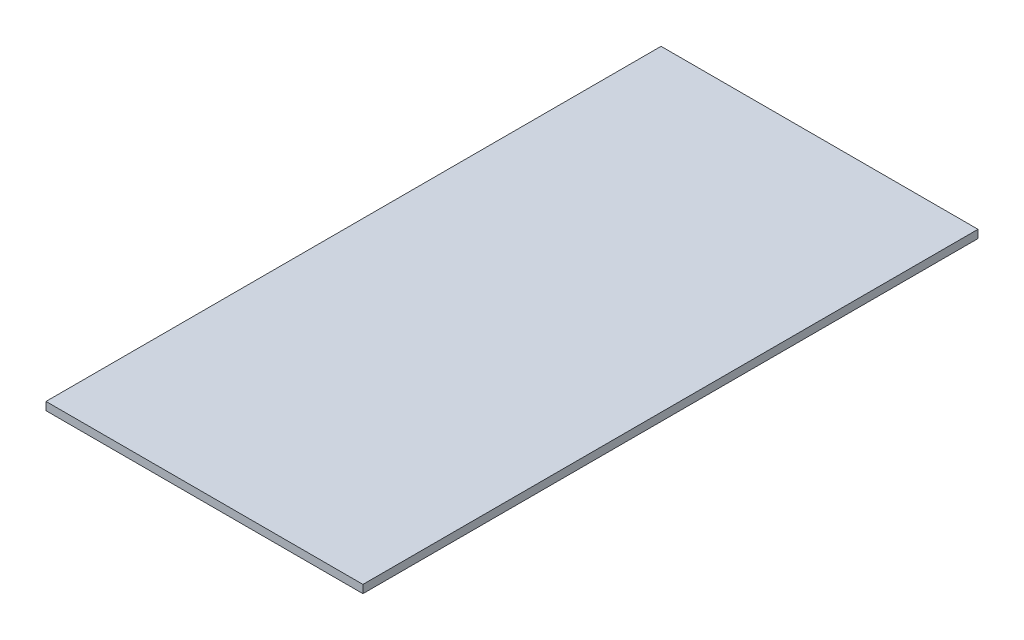
ISO-10303-21;
HEADER;
FILE_DESCRIPTION(('STEP AP214'),'2;1');
FILE_NAME('part.step','',(''),(''),'','','');
FILE_SCHEMA(('AUTOMOTIVE_DESIGN { 1 0 10303 214 1 1 1 1 }'));
ENDSEC;
DATA;
#1=APPLICATION_CONTEXT('core data for automotive mechanical design processes');
#2=APPLICATION_PROTOCOL_DEFINITION('international standard','automotive_design',2000,#1);
#3=PRODUCT_CONTEXT('',#1,'mechanical');
#4=PRODUCT('Part','Part','',(#3));
#5=PRODUCT_RELATED_PRODUCT_CATEGORY('part','',(#4));
#6=PRODUCT_DEFINITION_FORMATION('','',#4);
#7=PRODUCT_DEFINITION_CONTEXT('part definition',#1,'design');
#8=PRODUCT_DEFINITION('design','',#6,#7);
#9=PRODUCT_DEFINITION_SHAPE('','',#8);
#10=(LENGTH_UNIT() NAMED_UNIT(*) SI_UNIT(.MILLI.,.METRE.));
#11=(NAMED_UNIT(*) PLANE_ANGLE_UNIT() SI_UNIT($,.RADIAN.));
#12=(NAMED_UNIT(*) SI_UNIT($,.STERADIAN.) SOLID_ANGLE_UNIT());
#13=UNCERTAINTY_MEASURE_WITH_UNIT(LENGTH_MEASURE(1.E-05),#10,'distance_accuracy_value','');
#14=(GEOMETRIC_REPRESENTATION_CONTEXT(3) GLOBAL_UNCERTAINTY_ASSIGNED_CONTEXT((#13)) GLOBAL_UNIT_ASSIGNED_CONTEXT((#10,
#11,#12)) REPRESENTATION_CONTEXT('',''));
#15=CARTESIAN_POINT('',(0.,0.,0.));
#16=DIRECTION('',(0.,0.,1.));
#17=DIRECTION('',(1.,0.,0.));
#18=AXIS2_PLACEMENT_3D('',#15,#16,#17);
#19=CARTESIAN_POINT('',(59.,3.,114.5));
#20=DIRECTION('',(-1.,0.,0.));
#21=DIRECTION('',(0.,0.,1.));
#22=AXIS2_PLACEMENT_3D('',#19,#20,#21);
#23=PLANE('',#22);
#24=DIRECTION('',(0.,0.,-1.));
#25=VECTOR('',#24,1.);
#26=CARTESIAN_POINT('',(59.,0.,114.5));
#27=LINE('',#26,#25);
#28=CARTESIAN_POINT('',(59.,0.,114.5));
#29=VERTEX_POINT('',#28);
#30=CARTESIAN_POINT('',(59.,0.,-114.5));
#31=VERTEX_POINT('',#30);
#32=EDGE_CURVE('E113',#29,#31,#27,.T.);
#33=ORIENTED_EDGE('',*,*,#32,.T.);
#34=DIRECTION('',(0.,-1.,0.));
#35=VECTOR('',#34,1.);
#36=CARTESIAN_POINT('',(59.,3.,-114.5));
#37=LINE('',#36,#35);
#38=CARTESIAN_POINT('',(59.,3.,-114.5));
#39=VERTEX_POINT('',#38);
#40=EDGE_CURVE('E11',#39,#31,#37,.T.);
#41=ORIENTED_EDGE('',*,*,#40,.F.);
#42=DIRECTION('',(0.,0.,-1.));
#43=VECTOR('',#42,1.);
#44=CARTESIAN_POINT('',(59.,3.,114.5));
#45=LINE('',#44,#43);
#46=CARTESIAN_POINT('',(59.,3.,114.5));
#47=VERTEX_POINT('',#46);
#48=EDGE_CURVE('E97',#47,#39,#45,.T.);
#49=ORIENTED_EDGE('',*,*,#48,.F.);
#50=DIRECTION('',(0.,-1.,0.));
#51=VECTOR('',#50,1.);
#52=CARTESIAN_POINT('',(59.,3.,114.5));
#53=LINE('',#52,#51);
#54=EDGE_CURVE('E109',#47,#29,#53,.T.);
#55=ORIENTED_EDGE('',*,*,#54,.T.);
#56=EDGE_LOOP('',(#33,#41,#49,#55));
#57=FACE_BOUND('',#56,.T.);
#58=ADVANCED_FACE('F45',(#57),#23,.F.);
#59=CARTESIAN_POINT('',(-59.,3.,-114.5));
#60=DIRECTION('',(0.,0.,1.));
#61=DIRECTION('',(1.,0.,0.));
#62=AXIS2_PLACEMENT_3D('',#59,#60,#61);
#63=PLANE('',#62);
#64=DIRECTION('',(-1.,0.,0.));
#65=VECTOR('',#64,1.);
#66=CARTESIAN_POINT('',(-59.,0.,-114.5));
#67=LINE('',#66,#65);
#68=CARTESIAN_POINT('',(-59.,0.,-114.5));
#69=VERTEX_POINT('',#68);
#70=EDGE_CURVE('E102',#31,#69,#67,.T.);
#71=ORIENTED_EDGE('',*,*,#70,.T.);
#72=DIRECTION('',(0.,-1.,0.));
#73=VECTOR('',#72,1.);
#74=CARTESIAN_POINT('',(-59.,3.,-114.5));
#75=LINE('',#74,#73);
#76=CARTESIAN_POINT('',(-59.,3.,-114.5));
#77=VERTEX_POINT('',#76);
#78=EDGE_CURVE('E54',#77,#69,#75,.T.);
#79=ORIENTED_EDGE('',*,*,#78,.F.);
#80=DIRECTION('',(-1.,0.,0.));
#81=VECTOR('',#80,1.);
#82=CARTESIAN_POINT('',(-59.,3.,-114.5));
#83=LINE('',#82,#81);
#84=EDGE_CURVE('E92',#39,#77,#83,.T.);
#85=ORIENTED_EDGE('',*,*,#84,.F.);
#86=ORIENTED_EDGE('',*,*,#40,.T.);
#87=EDGE_LOOP('',(#71,#79,#85,#86));
#88=FACE_BOUND('',#87,.T.);
#89=ADVANCED_FACE('F101',(#88),#63,.F.);
#90=CARTESIAN_POINT('',(-59.,3.,114.5));
#91=DIRECTION('',(1.,0.,0.));
#92=DIRECTION('',(0.,0.,-1.));
#93=AXIS2_PLACEMENT_3D('',#90,#91,#92);
#94=PLANE('',#93);
#95=DIRECTION('',(0.,0.,1.));
#96=VECTOR('',#95,1.);
#97=CARTESIAN_POINT('',(-59.,0.,114.5));
#98=LINE('',#97,#96);
#99=CARTESIAN_POINT('',(-59.,0.,114.5));
#100=VERTEX_POINT('',#99);
#101=EDGE_CURVE('E79',#69,#100,#98,.T.);
#102=ORIENTED_EDGE('',*,*,#101,.T.);
#103=DIRECTION('',(0.,-1.,0.));
#104=VECTOR('',#103,1.);
#105=CARTESIAN_POINT('',(-59.,3.,114.5));
#106=LINE('',#105,#104);
#107=CARTESIAN_POINT('',(-59.,3.,114.5));
#108=VERTEX_POINT('',#107);
#109=EDGE_CURVE('E104',#108,#100,#106,.T.);
#110=ORIENTED_EDGE('',*,*,#109,.F.);
#111=DIRECTION('',(0.,0.,1.));
#112=VECTOR('',#111,1.);
#113=CARTESIAN_POINT('',(-59.,3.,114.5));
#114=LINE('',#113,#112);
#115=EDGE_CURVE('E95',#77,#108,#114,.T.);
#116=ORIENTED_EDGE('',*,*,#115,.F.);
#117=ORIENTED_EDGE('',*,*,#78,.T.);
#118=EDGE_LOOP('',(#102,#110,#116,#117));
#119=FACE_BOUND('',#118,.T.);
#120=ADVANCED_FACE('F105',(#119),#94,.F.);
#121=CARTESIAN_POINT('',(-59.,3.,114.5));
#122=DIRECTION('',(0.,0.,-1.));
#123=DIRECTION('',(-1.,0.,0.));
#124=AXIS2_PLACEMENT_3D('',#121,#122,#123);
#125=PLANE('',#124);
#126=DIRECTION('',(1.,0.,0.));
#127=VECTOR('',#126,1.);
#128=CARTESIAN_POINT('',(-59.,0.,114.5));
#129=LINE('',#128,#127);
#130=EDGE_CURVE('E85',#100,#29,#129,.T.);
#131=ORIENTED_EDGE('',*,*,#130,.T.);
#132=ORIENTED_EDGE('',*,*,#54,.F.);
#133=DIRECTION('',(1.,0.,0.));
#134=VECTOR('',#133,1.);
#135=CARTESIAN_POINT('',(-59.,3.,114.5));
#136=LINE('',#135,#134);
#137=EDGE_CURVE('E62',#108,#47,#136,.T.);
#138=ORIENTED_EDGE('',*,*,#137,.F.);
#139=ORIENTED_EDGE('',*,*,#109,.T.);
#140=EDGE_LOOP('',(#131,#132,#138,#139));
#141=FACE_BOUND('',#140,.T.);
#142=ADVANCED_FACE('F126',(#141),#125,.F.);
#143=CARTESIAN_POINT('',(0.,3.,0.));
#144=DIRECTION('',(0.,-1.,0.));
#145=DIRECTION('',(0.,0.,-1.));
#146=AXIS2_PLACEMENT_3D('',#143,#144,#145);
#147=PLANE('',#146);
#148=ORIENTED_EDGE('',*,*,#48,.T.);
#149=ORIENTED_EDGE('',*,*,#84,.T.);
#150=ORIENTED_EDGE('',*,*,#115,.T.);
#151=ORIENTED_EDGE('',*,*,#137,.T.);
#152=EDGE_LOOP('',(#148,#149,#150,#151));
#153=FACE_BOUND('',#152,.T.);
#154=ADVANCED_FACE('F93',(#153),#147,.F.);
#155=CARTESIAN_POINT('',(0.,0.,0.));
#156=DIRECTION('',(0.,-1.,0.));
#157=DIRECTION('',(0.,0.,-1.));
#158=AXIS2_PLACEMENT_3D('',#155,#156,#157);
#159=PLANE('',#158);
#160=ORIENTED_EDGE('',*,*,#32,.F.);
#161=ORIENTED_EDGE('',*,*,#130,.F.);
#162=ORIENTED_EDGE('',*,*,#101,.F.);
#163=ORIENTED_EDGE('',*,*,#70,.F.);
#164=EDGE_LOOP('',(#160,#161,#162,#163));
#165=FACE_BOUND('',#164,.T.);
#166=ADVANCED_FACE('F129',(#165),#159,.T.);
#167=CLOSED_SHELL('',(#58,#89,#120,#142,#154,#166));
#168=MANIFOLD_SOLID_BREP('B2',#167);
#169=ADVANCED_BREP_SHAPE_REPRESENTATION('',(#18,#168),#14);
#170=SHAPE_DEFINITION_REPRESENTATION(#9,#169);
ENDSEC;
END-ISO-10303-21;
